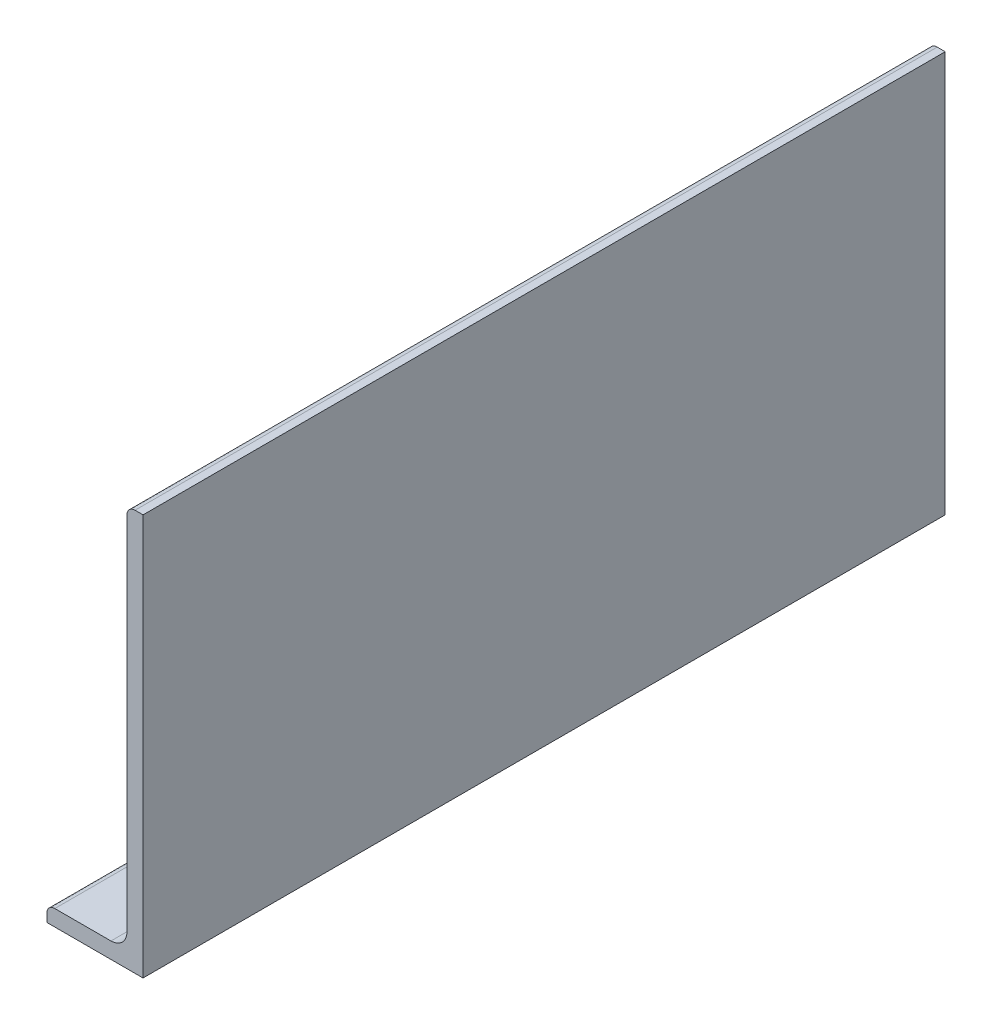
ISO-10303-21;
HEADER;
FILE_DESCRIPTION(('STEP AP214'),'2;1');
FILE_NAME('part.step','',(''),(''),'','','');
FILE_SCHEMA(('AUTOMOTIVE_DESIGN { 1 0 10303 214 1 1 1 1 }'));
ENDSEC;
DATA;
#1=APPLICATION_CONTEXT('core data for automotive mechanical design processes');
#2=APPLICATION_PROTOCOL_DEFINITION('international standard','automotive_design',2000,#1);
#3=PRODUCT_CONTEXT('',#1,'mechanical');
#4=PRODUCT('Part','Part','',(#3));
#5=PRODUCT_RELATED_PRODUCT_CATEGORY('part','',(#4));
#6=PRODUCT_DEFINITION_FORMATION('','',#4);
#7=PRODUCT_DEFINITION_CONTEXT('part definition',#1,'design');
#8=PRODUCT_DEFINITION('design','',#6,#7);
#9=PRODUCT_DEFINITION_SHAPE('','',#8);
#10=(LENGTH_UNIT() NAMED_UNIT(*) SI_UNIT(.MILLI.,.METRE.));
#11=(NAMED_UNIT(*) PLANE_ANGLE_UNIT() SI_UNIT($,.RADIAN.));
#12=(NAMED_UNIT(*) SI_UNIT($,.STERADIAN.) SOLID_ANGLE_UNIT());
#13=UNCERTAINTY_MEASURE_WITH_UNIT(LENGTH_MEASURE(1.E-05),#10,'distance_accuracy_value','');
#14=(GEOMETRIC_REPRESENTATION_CONTEXT(3) GLOBAL_UNCERTAINTY_ASSIGNED_CONTEXT((#13)) GLOBAL_UNIT_ASSIGNED_CONTEXT((#10,
#11,#12)) REPRESENTATION_CONTEXT('',''));
#15=CARTESIAN_POINT('',(0.,0.,0.));
#16=DIRECTION('',(0.,0.,1.));
#17=DIRECTION('',(1.,0.,0.));
#18=AXIS2_PLACEMENT_3D('',#15,#16,#17);
#19=CARTESIAN_POINT('',(180.753531725579,24.8288383133642,100.));
#20=DIRECTION('',(0.,-1.,0.));
#21=DIRECTION('',(0.,0.,-1.));
#22=AXIS2_PLACEMENT_3D('',#19,#20,#21);
#23=PLANE('',#22);
#24=DIRECTION('',(-1.,0.,0.));
#25=VECTOR('',#24,1.);
#26=CARTESIAN_POINT('',(180.753531725579,24.8288383133642,0.));
#27=LINE('',#26,#25);
#28=CARTESIAN_POINT('',(182.753531725579,24.8288383133642,0.));
#29=VERTEX_POINT('',#28);
#30=CARTESIAN_POINT('',(181.753531725579,24.8288383133642,0.));
#31=VERTEX_POINT('',#30);
#32=EDGE_CURVE('E136',#29,#31,#27,.T.);
#33=ORIENTED_EDGE('',*,*,#32,.T.);
#34=DIRECTION('',(0.,0.,-1.));
#35=VECTOR('',#34,1.);
#36=CARTESIAN_POINT('',(181.753531725579,24.8288383133642,100.));
#37=LINE('',#36,#35);
#38=CARTESIAN_POINT('',(181.753531725579,24.8288383133642,100.));
#39=VERTEX_POINT('',#38);
#40=EDGE_CURVE('E160',#31,#39,#37,.F.);
#41=ORIENTED_EDGE('',*,*,#40,.T.);
#42=DIRECTION('',(-1.,0.,0.));
#43=VECTOR('',#42,1.);
#44=CARTESIAN_POINT('',(180.753531725579,24.8288383133642,100.));
#45=LINE('',#44,#43);
#46=CARTESIAN_POINT('',(182.753531725579,24.8288383133642,100.));
#47=VERTEX_POINT('',#46);
#48=EDGE_CURVE('E149',#47,#39,#45,.T.);
#49=ORIENTED_EDGE('',*,*,#48,.F.);
#50=DIRECTION('',(0.,0.,-1.));
#51=VECTOR('',#50,1.);
#52=CARTESIAN_POINT('',(182.753531725579,24.8288383133642,100.));
#53=LINE('',#52,#51);
#54=EDGE_CURVE('E132',#47,#29,#53,.T.);
#55=ORIENTED_EDGE('',*,*,#54,.T.);
#56=EDGE_LOOP('',(#33,#41,#49,#55));
#57=FACE_BOUND('',#56,.T.);
#58=ADVANCED_FACE('F33',(#57),#23,.F.);
#59=CARTESIAN_POINT('',(180.753531725579,-23.1711616866358,100.));
#60=DIRECTION('',(1.,0.,0.));
#61=DIRECTION('',(0.,0.,-1.));
#62=AXIS2_PLACEMENT_3D('',#59,#60,#61);
#63=PLANE('',#62);
#64=DIRECTION('',(0.,-1.,0.));
#65=VECTOR('',#64,1.);
#66=CARTESIAN_POINT('',(180.753531725579,-23.1711616866358,0.));
#67=LINE('',#66,#65);
#68=CARTESIAN_POINT('',(180.753531725579,23.8288383133642,0.));
#69=VERTEX_POINT('',#68);
#70=CARTESIAN_POINT('',(180.753531725579,-21.1711616866358,0.));
#71=VERTEX_POINT('',#70);
#72=EDGE_CURVE('E139',#69,#71,#67,.T.);
#73=ORIENTED_EDGE('',*,*,#72,.T.);
#74=DIRECTION('',(0.,0.,-1.));
#75=VECTOR('',#74,1.);
#76=CARTESIAN_POINT('',(180.753531725579,-21.1711616866358,100.));
#77=LINE('',#76,#75);
#78=CARTESIAN_POINT('',(180.753531725579,-21.1711616866358,100.));
#79=VERTEX_POINT('',#78);
#80=EDGE_CURVE('E54',#71,#79,#77,.F.);
#81=ORIENTED_EDGE('',*,*,#80,.T.);
#82=DIRECTION('',(0.,-1.,0.));
#83=VECTOR('',#82,1.);
#84=CARTESIAN_POINT('',(180.753531725579,-23.1711616866358,100.));
#85=LINE('',#84,#83);
#86=CARTESIAN_POINT('',(180.753531725579,23.8288383133642,100.));
#87=VERTEX_POINT('',#86);
#88=EDGE_CURVE('E241',#87,#79,#85,.T.);
#89=ORIENTED_EDGE('',*,*,#88,.F.);
#90=DIRECTION('',(0.,0.,-1.));
#91=VECTOR('',#90,1.);
#92=CARTESIAN_POINT('',(180.753531725579,23.8288383133642,100.));
#93=LINE('',#92,#91);
#94=EDGE_CURVE('E124',#87,#69,#93,.T.);
#95=ORIENTED_EDGE('',*,*,#94,.T.);
#96=EDGE_LOOP('',(#73,#81,#89,#95));
#97=FACE_BOUND('',#96,.T.);
#98=ADVANCED_FACE('F193',(#97),#63,.F.);
#99=CARTESIAN_POINT('',(170.753531725579,-23.1711616866358,100.));
#100=DIRECTION('',(0.,-1.,0.));
#101=DIRECTION('',(0.,0.,-1.));
#102=AXIS2_PLACEMENT_3D('',#99,#100,#101);
#103=PLANE('',#102);
#104=CARTESIAN_POINT('',(175.253531725579,-23.1711616866358,80.));
#105=DIRECTION('',(0.,1.,0.));
#106=DIRECTION('',(0.,0.,1.));
#107=AXIS2_PLACEMENT_3D('',#104,#105,#106);
#108=CIRCLE('',#107,1.59999999999999);
#109=CARTESIAN_POINT('',(175.253531725579,-23.1711616866358,81.6));
#110=VERTEX_POINT('',#109);
#111=EDGE_CURVE('E230',#110,#110,#108,.T.);
#112=ORIENTED_EDGE('',*,*,#111,.F.);
#113=EDGE_LOOP('',(#112));
#114=FACE_BOUND('',#113,.T.);
#115=CARTESIAN_POINT('',(175.253531725579,-23.1711616866358,20.));
#116=DIRECTION('',(0.,1.,0.));
#117=DIRECTION('',(0.,0.,1.));
#118=AXIS2_PLACEMENT_3D('',#115,#116,#117);
#119=CIRCLE('',#118,1.59999999999999);
#120=CARTESIAN_POINT('',(175.253531725579,-23.1711616866358,21.6));
#121=VERTEX_POINT('',#120);
#122=EDGE_CURVE('E235',#121,#121,#119,.T.);
#123=ORIENTED_EDGE('',*,*,#122,.F.);
#124=EDGE_LOOP('',(#123));
#125=FACE_BOUND('',#124,.T.);
#126=DIRECTION('',(-1.,0.,0.));
#127=VECTOR('',#126,1.);
#128=CARTESIAN_POINT('',(170.753531725579,-23.1711616866358,100.));
#129=LINE('',#128,#127);
#130=CARTESIAN_POINT('',(178.753531725579,-23.1711616866358,100.));
#131=VERTEX_POINT('',#130);
#132=CARTESIAN_POINT('',(171.753531725579,-23.1711616866358,100.));
#133=VERTEX_POINT('',#132);
#134=EDGE_CURVE('E115',#131,#133,#129,.T.);
#135=ORIENTED_EDGE('',*,*,#134,.F.);
#136=DIRECTION('',(0.,0.,-1.));
#137=VECTOR('',#136,1.);
#138=CARTESIAN_POINT('',(178.753531725579,-23.1711616866358,0.));
#139=LINE('',#138,#137);
#140=CARTESIAN_POINT('',(178.753531725579,-23.1711616866358,0.));
#141=VERTEX_POINT('',#140);
#142=EDGE_CURVE('E170',#131,#141,#139,.T.);
#143=ORIENTED_EDGE('',*,*,#142,.T.);
#144=DIRECTION('',(-1.,0.,0.));
#145=VECTOR('',#144,1.);
#146=CARTESIAN_POINT('',(170.753531725579,-23.1711616866358,0.));
#147=LINE('',#146,#145);
#148=CARTESIAN_POINT('',(171.753531725579,-23.1711616866358,0.));
#149=VERTEX_POINT('',#148);
#150=EDGE_CURVE('E142',#141,#149,#147,.T.);
#151=ORIENTED_EDGE('',*,*,#150,.T.);
#152=DIRECTION('',(0.,0.,-1.));
#153=VECTOR('',#152,1.);
#154=CARTESIAN_POINT('',(171.753531725579,-23.1711616866358,100.));
#155=LINE('',#154,#153);
#156=EDGE_CURVE('E167',#149,#133,#155,.F.);
#157=ORIENTED_EDGE('',*,*,#156,.T.);
#158=EDGE_LOOP('',(#135,#143,#151,#157));
#159=FACE_BOUND('',#158,.T.);
#160=ADVANCED_FACE('F176',(#114,#125,#159),#103,.F.);
#161=CARTESIAN_POINT('',(170.753531725579,-25.1711616866358,100.));
#162=DIRECTION('',(1.,0.,0.));
#163=DIRECTION('',(0.,0.,-1.));
#164=AXIS2_PLACEMENT_3D('',#161,#162,#163);
#165=PLANE('',#164);
#166=DIRECTION('',(0.,-1.,0.));
#167=VECTOR('',#166,1.);
#168=CARTESIAN_POINT('',(170.753531725579,-25.1711616866358,100.));
#169=LINE('',#168,#167);
#170=CARTESIAN_POINT('',(170.753531725579,-24.1711616866358,100.));
#171=VERTEX_POINT('',#170);
#172=CARTESIAN_POINT('',(170.753531725579,-25.1711616866358,100.));
#173=VERTEX_POINT('',#172);
#174=EDGE_CURVE('E103',#171,#173,#169,.T.);
#175=ORIENTED_EDGE('',*,*,#174,.F.);
#176=DIRECTION('',(0.,0.,-1.));
#177=VECTOR('',#176,1.);
#178=CARTESIAN_POINT('',(170.753531725579,-24.1711616866358,100.));
#179=LINE('',#178,#177);
#180=CARTESIAN_POINT('',(170.753531725579,-24.1711616866358,0.));
#181=VERTEX_POINT('',#180);
#182=EDGE_CURVE('E165',#171,#181,#179,.T.);
#183=ORIENTED_EDGE('',*,*,#182,.T.);
#184=DIRECTION('',(0.,-1.,0.));
#185=VECTOR('',#184,1.);
#186=CARTESIAN_POINT('',(170.753531725579,-25.1711616866358,0.));
#187=LINE('',#186,#185);
#188=CARTESIAN_POINT('',(170.753531725579,-25.1711616866358,0.));
#189=VERTEX_POINT('',#188);
#190=EDGE_CURVE('E121',#181,#189,#187,.T.);
#191=ORIENTED_EDGE('',*,*,#190,.T.);
#192=DIRECTION('',(0.,0.,-1.));
#193=VECTOR('',#192,1.);
#194=CARTESIAN_POINT('',(170.753531725579,-25.1711616866358,100.));
#195=LINE('',#194,#193);
#196=EDGE_CURVE('E118',#173,#189,#195,.T.);
#197=ORIENTED_EDGE('',*,*,#196,.F.);
#198=EDGE_LOOP('',(#175,#183,#191,#197));
#199=FACE_BOUND('',#198,.T.);
#200=ADVANCED_FACE('F119',(#199),#165,.F.);
#201=CARTESIAN_POINT('',(182.753531725579,-25.1711616866358,100.));
#202=DIRECTION('',(0.,1.,0.));
#203=DIRECTION('',(0.,0.,1.));
#204=AXIS2_PLACEMENT_3D('',#201,#202,#203);
#205=PLANE('',#204);
#206=CARTESIAN_POINT('',(175.253531725579,-25.1711616866358,80.));
#207=DIRECTION('',(0.,1.,0.));
#208=DIRECTION('',(0.,0.,1.));
#209=AXIS2_PLACEMENT_3D('',#206,#207,#208);
#210=CIRCLE('',#209,1.59999999999999);
#211=CARTESIAN_POINT('',(175.253531725579,-25.1711616866358,81.6));
#212=VERTEX_POINT('',#211);
#213=EDGE_CURVE('E140',#212,#212,#210,.T.);
#214=ORIENTED_EDGE('',*,*,#213,.T.);
#215=EDGE_LOOP('',(#214));
#216=FACE_BOUND('',#215,.T.);
#217=CARTESIAN_POINT('',(175.253531725579,-25.1711616866358,20.));
#218=DIRECTION('',(0.,1.,0.));
#219=DIRECTION('',(0.,0.,1.));
#220=AXIS2_PLACEMENT_3D('',#217,#218,#219);
#221=CIRCLE('',#220,1.59999999999999);
#222=CARTESIAN_POINT('',(175.253531725579,-25.1711616866358,21.6));
#223=VERTEX_POINT('',#222);
#224=EDGE_CURVE('E231',#223,#223,#221,.T.);
#225=ORIENTED_EDGE('',*,*,#224,.T.);
#226=EDGE_LOOP('',(#225));
#227=FACE_BOUND('',#226,.T.);
#228=DIRECTION('',(1.,0.,0.));
#229=VECTOR('',#228,1.);
#230=CARTESIAN_POINT('',(182.753531725579,-25.1711616866358,0.));
#231=LINE('',#230,#229);
#232=CARTESIAN_POINT('',(182.753531725579,-25.1711616866358,0.));
#233=VERTEX_POINT('',#232);
#234=EDGE_CURVE('E145',#189,#233,#231,.T.);
#235=ORIENTED_EDGE('',*,*,#234,.T.);
#236=DIRECTION('',(0.,0.,-1.));
#237=VECTOR('',#236,1.);
#238=CARTESIAN_POINT('',(182.753531725579,-25.1711616866358,100.));
#239=LINE('',#238,#237);
#240=CARTESIAN_POINT('',(182.753531725579,-25.1711616866358,100.));
#241=VERTEX_POINT('',#240);
#242=EDGE_CURVE('E125',#241,#233,#239,.T.);
#243=ORIENTED_EDGE('',*,*,#242,.F.);
#244=DIRECTION('',(1.,0.,0.));
#245=VECTOR('',#244,1.);
#246=CARTESIAN_POINT('',(182.753531725579,-25.1711616866358,100.));
#247=LINE('',#246,#245);
#248=EDGE_CURVE('E108',#173,#241,#247,.T.);
#249=ORIENTED_EDGE('',*,*,#248,.F.);
#250=ORIENTED_EDGE('',*,*,#196,.T.);
#251=EDGE_LOOP('',(#235,#243,#249,#250));
#252=FACE_BOUND('',#251,.T.);
#253=ADVANCED_FACE('F127',(#216,#227,#252),#205,.F.);
#254=CARTESIAN_POINT('',(182.753531725579,24.8288383133642,100.));
#255=DIRECTION('',(-1.,0.,0.));
#256=DIRECTION('',(0.,0.,1.));
#257=AXIS2_PLACEMENT_3D('',#254,#255,#256);
#258=PLANE('',#257);
#259=DIRECTION('',(0.,1.,0.));
#260=VECTOR('',#259,1.);
#261=CARTESIAN_POINT('',(182.753531725579,24.8288383133642,0.));
#262=LINE('',#261,#260);
#263=EDGE_CURVE('E147',#233,#29,#262,.T.);
#264=ORIENTED_EDGE('',*,*,#263,.T.);
#265=ORIENTED_EDGE('',*,*,#54,.F.);
#266=DIRECTION('',(0.,1.,0.));
#267=VECTOR('',#266,1.);
#268=CARTESIAN_POINT('',(182.753531725579,24.8288383133642,100.));
#269=LINE('',#268,#267);
#270=EDGE_CURVE('E130',#241,#47,#269,.T.);
#271=ORIENTED_EDGE('',*,*,#270,.F.);
#272=ORIENTED_EDGE('',*,*,#242,.T.);
#273=EDGE_LOOP('',(#264,#265,#271,#272));
#274=FACE_BOUND('',#273,.T.);
#275=ADVANCED_FACE('F208',(#274),#258,.F.);
#276=CARTESIAN_POINT('',(0.,0.,100.));
#277=DIRECTION('',(0.,0.,-1.));
#278=DIRECTION('',(-1.,0.,0.));
#279=AXIS2_PLACEMENT_3D('',#276,#277,#278);
#280=PLANE('',#279);
#281=ORIENTED_EDGE('',*,*,#48,.T.);
#282=CARTESIAN_POINT('',(181.753531725579,23.8288383133642,100.));
#283=DIRECTION('',(0.,0.,-1.));
#284=DIRECTION('',(-1.,0.,0.));
#285=AXIS2_PLACEMENT_3D('',#282,#283,#284);
#286=CIRCLE('',#285,1.);
#287=EDGE_CURVE('E163',#39,#87,#286,.F.);
#288=ORIENTED_EDGE('',*,*,#287,.T.);
#289=ORIENTED_EDGE('',*,*,#88,.T.);
#290=CARTESIAN_POINT('',(178.753531725579,-21.1711616866358,100.));
#291=DIRECTION('',(0.,0.,-1.));
#292=DIRECTION('',(-1.,0.,0.));
#293=AXIS2_PLACEMENT_3D('',#290,#291,#292);
#294=CIRCLE('',#293,2.);
#295=EDGE_CURVE('E11',#79,#131,#294,.T.);
#296=ORIENTED_EDGE('',*,*,#295,.T.);
#297=ORIENTED_EDGE('',*,*,#134,.T.);
#298=CARTESIAN_POINT('',(171.753531725579,-24.1711616866358,100.));
#299=DIRECTION('',(0.,0.,-1.));
#300=DIRECTION('',(-1.,0.,0.));
#301=AXIS2_PLACEMENT_3D('',#298,#299,#300);
#302=CIRCLE('',#301,1.);
#303=EDGE_CURVE('E111',#133,#171,#302,.F.);
#304=ORIENTED_EDGE('',*,*,#303,.T.);
#305=ORIENTED_EDGE('',*,*,#174,.T.);
#306=ORIENTED_EDGE('',*,*,#248,.T.);
#307=ORIENTED_EDGE('',*,*,#270,.T.);
#308=EDGE_LOOP('',(#281,#288,#289,#296,#297,#304,#305,#306,#307));
#309=FACE_BOUND('',#308,.T.);
#310=ADVANCED_FACE('F106',(#309),#280,.F.);
#311=CARTESIAN_POINT('',(0.,0.,0.));
#312=DIRECTION('',(0.,0.,-1.));
#313=DIRECTION('',(-1.,0.,0.));
#314=AXIS2_PLACEMENT_3D('',#311,#312,#313);
#315=PLANE('',#314);
#316=ORIENTED_EDGE('',*,*,#72,.F.);
#317=CARTESIAN_POINT('',(181.753531725579,23.8288383133642,0.));
#318=DIRECTION('',(0.,0.,-1.));
#319=DIRECTION('',(-1.,0.,0.));
#320=AXIS2_PLACEMENT_3D('',#317,#318,#319);
#321=CIRCLE('',#320,1.);
#322=EDGE_CURVE('E158',#69,#31,#321,.T.);
#323=ORIENTED_EDGE('',*,*,#322,.T.);
#324=ORIENTED_EDGE('',*,*,#32,.F.);
#325=ORIENTED_EDGE('',*,*,#263,.F.);
#326=ORIENTED_EDGE('',*,*,#234,.F.);
#327=ORIENTED_EDGE('',*,*,#190,.F.);
#328=CARTESIAN_POINT('',(171.753531725579,-24.1711616866358,0.));
#329=DIRECTION('',(0.,0.,-1.));
#330=DIRECTION('',(-1.,0.,0.));
#331=AXIS2_PLACEMENT_3D('',#328,#329,#330);
#332=CIRCLE('',#331,1.);
#333=EDGE_CURVE('E155',#181,#149,#332,.T.);
#334=ORIENTED_EDGE('',*,*,#333,.T.);
#335=ORIENTED_EDGE('',*,*,#150,.F.);
#336=CARTESIAN_POINT('',(178.753531725579,-21.1711616866358,0.));
#337=DIRECTION('',(0.,0.,-1.));
#338=DIRECTION('',(-1.,0.,0.));
#339=AXIS2_PLACEMENT_3D('',#336,#337,#338);
#340=CIRCLE('',#339,2.);
#341=EDGE_CURVE('E41',#141,#71,#340,.F.);
#342=ORIENTED_EDGE('',*,*,#341,.T.);
#343=EDGE_LOOP('',(#316,#323,#324,#325,#326,#327,#334,#335,#342));
#344=FACE_BOUND('',#343,.T.);
#345=ADVANCED_FACE('F179',(#344),#315,.T.);
#346=CARTESIAN_POINT('',(181.753531725579,23.8288383133642,100.));
#347=DIRECTION('',(0.,0.,-1.));
#348=DIRECTION('',(-1.,0.,0.));
#349=AXIS2_PLACEMENT_3D('',#346,#347,#348);
#350=CYLINDRICAL_SURFACE('',#349,1.);
#351=ORIENTED_EDGE('',*,*,#287,.F.);
#352=ORIENTED_EDGE('',*,*,#40,.F.);
#353=ORIENTED_EDGE('',*,*,#322,.F.);
#354=ORIENTED_EDGE('',*,*,#94,.F.);
#355=EDGE_LOOP('',(#351,#352,#353,#354));
#356=FACE_BOUND('',#355,.T.);
#357=ADVANCED_FACE('F184',(#356),#350,.T.);
#358=CARTESIAN_POINT('',(171.753531725579,-24.1711616866358,100.));
#359=DIRECTION('',(0.,0.,-1.));
#360=DIRECTION('',(-1.,0.,0.));
#361=AXIS2_PLACEMENT_3D('',#358,#359,#360);
#362=CYLINDRICAL_SURFACE('',#361,1.);
#363=ORIENTED_EDGE('',*,*,#303,.F.);
#364=ORIENTED_EDGE('',*,*,#156,.F.);
#365=ORIENTED_EDGE('',*,*,#333,.F.);
#366=ORIENTED_EDGE('',*,*,#182,.F.);
#367=EDGE_LOOP('',(#363,#364,#365,#366));
#368=FACE_BOUND('',#367,.T.);
#369=ADVANCED_FACE('F182',(#368),#362,.T.);
#370=CARTESIAN_POINT('',(178.753531725579,-21.1711616866358,100.));
#371=DIRECTION('',(0.,0.,1.));
#372=DIRECTION('',(1.,0.,0.));
#373=AXIS2_PLACEMENT_3D('',#370,#371,#372);
#374=CYLINDRICAL_SURFACE('',#373,2.);
#375=ORIENTED_EDGE('',*,*,#295,.F.);
#376=ORIENTED_EDGE('',*,*,#80,.F.);
#377=ORIENTED_EDGE('',*,*,#341,.F.);
#378=ORIENTED_EDGE('',*,*,#142,.F.);
#379=EDGE_LOOP('',(#375,#376,#377,#378));
#380=FACE_BOUND('',#379,.T.);
#381=ADVANCED_FACE('F35',(#380),#374,.F.);
#382=CARTESIAN_POINT('',(175.253531725579,-25.1711616866358,20.));
#383=DIRECTION('',(0.,1.,0.));
#384=DIRECTION('',(0.,0.,1.));
#385=AXIS2_PLACEMENT_3D('',#382,#383,#384);
#386=CYLINDRICAL_SURFACE('',#385,1.59999999999999);
#387=ORIENTED_EDGE('',*,*,#224,.F.);
#388=EDGE_LOOP('',(#387));
#389=FACE_BOUND('',#388,.T.);
#390=ORIENTED_EDGE('',*,*,#122,.T.);
#391=EDGE_LOOP('',(#390));
#392=FACE_BOUND('',#391,.T.);
#393=ADVANCED_FACE('F189',(#389,#392),#386,.F.);
#394=CARTESIAN_POINT('',(175.253531725579,-25.1711616866358,80.));
#395=DIRECTION('',(0.,1.,0.));
#396=DIRECTION('',(0.,0.,1.));
#397=AXIS2_PLACEMENT_3D('',#394,#395,#396);
#398=CYLINDRICAL_SURFACE('',#397,1.59999999999999);
#399=ORIENTED_EDGE('',*,*,#213,.F.);
#400=EDGE_LOOP('',(#399));
#401=FACE_BOUND('',#400,.T.);
#402=ORIENTED_EDGE('',*,*,#111,.T.);
#403=EDGE_LOOP('',(#402));
#404=FACE_BOUND('',#403,.T.);
#405=ADVANCED_FACE('F219',(#401,#404),#398,.F.);
#406=CLOSED_SHELL('',(#58,#98,#160,#200,#253,#275,#310,#345,#357,#369,#381,#393,#405));
#407=MANIFOLD_SOLID_BREP('B2',#406);
#408=ADVANCED_BREP_SHAPE_REPRESENTATION('',(#18,#407),#14);
#409=SHAPE_DEFINITION_REPRESENTATION(#9,#408);
ENDSEC;
END-ISO-10303-21;
